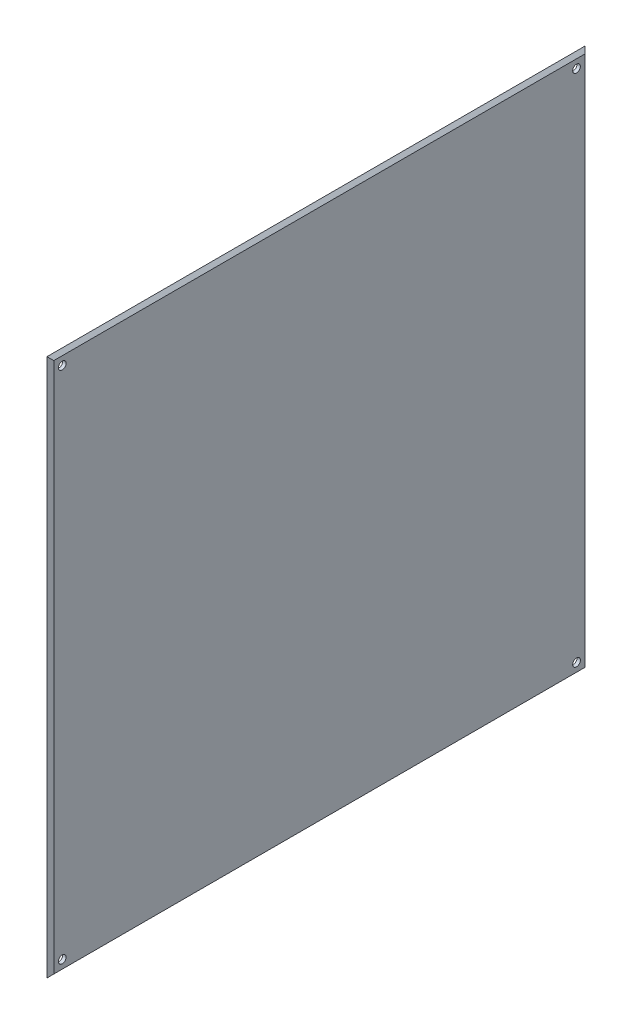
ISO-10303-21;
HEADER;
FILE_DESCRIPTION(('STEP AP214'),'2;1');
FILE_NAME('part.step','',(''),(''),'','','');
FILE_SCHEMA(('AUTOMOTIVE_DESIGN { 1 0 10303 214 1 1 1 1 }'));
ENDSEC;
DATA;
#1=APPLICATION_CONTEXT('core data for automotive mechanical design processes');
#2=APPLICATION_PROTOCOL_DEFINITION('international standard','automotive_design',2000,#1);
#3=PRODUCT_CONTEXT('',#1,'mechanical');
#4=PRODUCT('Part','Part','',(#3));
#5=PRODUCT_RELATED_PRODUCT_CATEGORY('part','',(#4));
#6=PRODUCT_DEFINITION_FORMATION('','',#4);
#7=PRODUCT_DEFINITION_CONTEXT('part definition',#1,'design');
#8=PRODUCT_DEFINITION('design','',#6,#7);
#9=PRODUCT_DEFINITION_SHAPE('','',#8);
#10=(LENGTH_UNIT() NAMED_UNIT(*) SI_UNIT(.MILLI.,.METRE.));
#11=(NAMED_UNIT(*) PLANE_ANGLE_UNIT() SI_UNIT($,.RADIAN.));
#12=(NAMED_UNIT(*) SI_UNIT($,.STERADIAN.) SOLID_ANGLE_UNIT());
#13=UNCERTAINTY_MEASURE_WITH_UNIT(LENGTH_MEASURE(1.E-05),#10,'distance_accuracy_value','');
#14=(GEOMETRIC_REPRESENTATION_CONTEXT(3) GLOBAL_UNCERTAINTY_ASSIGNED_CONTEXT((#13)) GLOBAL_UNIT_ASSIGNED_CONTEXT((#10,
#11,#12)) REPRESENTATION_CONTEXT('',''));
#15=CARTESIAN_POINT('',(0.,0.,0.));
#16=DIRECTION('',(0.,0.,1.));
#17=DIRECTION('',(1.,0.,0.));
#18=AXIS2_PLACEMENT_3D('',#15,#16,#17);
#19=CARTESIAN_POINT('',(2.,0.,0.));
#20=DIRECTION('',(1.,0.,0.));
#21=DIRECTION('',(0.,0.,-1.));
#22=AXIS2_PLACEMENT_3D('',#19,#20,#21);
#23=PLANE('',#22);
#24=CARTESIAN_POINT('',(2.,309.,-309.));
#25=DIRECTION('',(1.,0.,0.));
#26=DIRECTION('',(0.,0.,-1.));
#27=AXIS2_PLACEMENT_3D('',#24,#25,#26);
#28=CIRCLE('',#27,2.24999999999997);
#29=CARTESIAN_POINT('',(2.,309.,-311.25));
#30=VERTEX_POINT('',#29);
#31=EDGE_CURVE('E235',#30,#30,#28,.T.);
#32=ORIENTED_EDGE('',*,*,#31,.F.);
#33=EDGE_LOOP('',(#32));
#34=FACE_BOUND('',#33,.T.);
#35=CARTESIAN_POINT('',(2.,7.00000000000004,-309.));
#36=DIRECTION('',(1.,0.,0.));
#37=DIRECTION('',(0.,0.,-1.));
#38=AXIS2_PLACEMENT_3D('',#35,#36,#37);
#39=CIRCLE('',#38,2.25);
#40=CARTESIAN_POINT('',(2.,7.00000000000004,-311.25));
#41=VERTEX_POINT('',#40);
#42=EDGE_CURVE('E240',#41,#41,#39,.T.);
#43=ORIENTED_EDGE('',*,*,#42,.F.);
#44=EDGE_LOOP('',(#43));
#45=FACE_BOUND('',#44,.T.);
#46=CARTESIAN_POINT('',(2.,7.,-7.));
#47=DIRECTION('',(1.,0.,0.));
#48=DIRECTION('',(0.,0.,-1.));
#49=AXIS2_PLACEMENT_3D('',#46,#47,#48);
#50=CIRCLE('',#49,2.25);
#51=CARTESIAN_POINT('',(2.,7.,-9.25));
#52=VERTEX_POINT('',#51);
#53=EDGE_CURVE('E253',#52,#52,#50,.T.);
#54=ORIENTED_EDGE('',*,*,#53,.F.);
#55=EDGE_LOOP('',(#54));
#56=FACE_BOUND('',#55,.T.);
#57=CARTESIAN_POINT('',(2.,309.,-7.));
#58=DIRECTION('',(1.,0.,0.));
#59=DIRECTION('',(0.,0.,-1.));
#60=AXIS2_PLACEMENT_3D('',#57,#58,#59);
#61=CIRCLE('',#60,2.24999999999997);
#62=CARTESIAN_POINT('',(2.,309.,-9.24999999999998));
#63=VERTEX_POINT('',#62);
#64=EDGE_CURVE('E256',#63,#63,#61,.T.);
#65=ORIENTED_EDGE('',*,*,#64,.F.);
#66=EDGE_LOOP('',(#65));
#67=FACE_BOUND('',#66,.T.);
#68=DIRECTION('',(0.,0.,1.));
#69=VECTOR('',#68,1.);
#70=CARTESIAN_POINT('',(2.,314.,0.));
#71=LINE('',#70,#69);
#72=CARTESIAN_POINT('',(2.,314.,-314.));
#73=VERTEX_POINT('',#72);
#74=CARTESIAN_POINT('',(2.,314.,-2.));
#75=VERTEX_POINT('',#74);
#76=EDGE_CURVE('E56',#73,#75,#71,.T.);
#77=ORIENTED_EDGE('',*,*,#76,.T.);
#78=DIRECTION('',(0.,-1.,0.));
#79=VECTOR('',#78,1.);
#80=CARTESIAN_POINT('',(2.,0.,-2.));
#81=LINE('',#80,#79);
#82=CARTESIAN_POINT('',(2.,2.,-2.));
#83=VERTEX_POINT('',#82);
#84=EDGE_CURVE('E11',#75,#83,#81,.T.);
#85=ORIENTED_EDGE('',*,*,#84,.T.);
#86=DIRECTION('',(0.,0.,-1.));
#87=VECTOR('',#86,1.);
#88=CARTESIAN_POINT('',(2.,2.,-316.));
#89=LINE('',#88,#87);
#90=CARTESIAN_POINT('',(2.,2.,-314.));
#91=VERTEX_POINT('',#90);
#92=EDGE_CURVE('E121',#83,#91,#89,.T.);
#93=ORIENTED_EDGE('',*,*,#92,.T.);
#94=DIRECTION('',(0.,1.,0.));
#95=VECTOR('',#94,1.);
#96=CARTESIAN_POINT('',(2.,316.,-314.));
#97=LINE('',#96,#95);
#98=EDGE_CURVE('E67',#91,#73,#97,.T.);
#99=ORIENTED_EDGE('',*,*,#98,.T.);
#100=EDGE_LOOP('',(#77,#85,#93,#99));
#101=FACE_BOUND('',#100,.T.);
#102=ADVANCED_FACE('F45',(#34,#45,#56,#67,#101),#23,.T.);
#103=CARTESIAN_POINT('',(0.,0.,0.));
#104=DIRECTION('',(1.,0.,0.));
#105=DIRECTION('',(0.,0.,-1.));
#106=AXIS2_PLACEMENT_3D('',#103,#104,#105);
#107=PLANE('',#106);
#108=CARTESIAN_POINT('',(0.,309.,-309.));
#109=DIRECTION('',(1.,0.,0.));
#110=DIRECTION('',(0.,0.,-1.));
#111=AXIS2_PLACEMENT_3D('',#108,#109,#110);
#112=CIRCLE('',#111,2.24999999999997);
#113=CARTESIAN_POINT('',(0.,309.,-311.25));
#114=VERTEX_POINT('',#113);
#115=EDGE_CURVE('E238',#114,#114,#112,.T.);
#116=ORIENTED_EDGE('',*,*,#115,.T.);
#117=EDGE_LOOP('',(#116));
#118=FACE_BOUND('',#117,.T.);
#119=CARTESIAN_POINT('',(0.,7.00000000000004,-309.));
#120=DIRECTION('',(1.,0.,0.));
#121=DIRECTION('',(0.,0.,-1.));
#122=AXIS2_PLACEMENT_3D('',#119,#120,#121);
#123=CIRCLE('',#122,2.25);
#124=CARTESIAN_POINT('',(0.,7.00000000000004,-311.25));
#125=VERTEX_POINT('',#124);
#126=EDGE_CURVE('E246',#125,#125,#123,.T.);
#127=ORIENTED_EDGE('',*,*,#126,.T.);
#128=EDGE_LOOP('',(#127));
#129=FACE_BOUND('',#128,.T.);
#130=CARTESIAN_POINT('',(0.,7.,-7.));
#131=DIRECTION('',(1.,0.,0.));
#132=DIRECTION('',(0.,0.,-1.));
#133=AXIS2_PLACEMENT_3D('',#130,#131,#132);
#134=CIRCLE('',#133,2.25);
#135=CARTESIAN_POINT('',(0.,7.,-9.25));
#136=VERTEX_POINT('',#135);
#137=EDGE_CURVE('E50',#136,#136,#134,.T.);
#138=ORIENTED_EDGE('',*,*,#137,.T.);
#139=EDGE_LOOP('',(#138));
#140=FACE_BOUND('',#139,.T.);
#141=CARTESIAN_POINT('',(0.,309.,-7.));
#142=DIRECTION('',(1.,0.,0.));
#143=DIRECTION('',(0.,0.,-1.));
#144=AXIS2_PLACEMENT_3D('',#141,#142,#143);
#145=CIRCLE('',#144,2.24999999999997);
#146=CARTESIAN_POINT('',(0.,309.,-9.24999999999998));
#147=VERTEX_POINT('',#146);
#148=EDGE_CURVE('E113',#147,#147,#145,.T.);
#149=ORIENTED_EDGE('',*,*,#148,.T.);
#150=EDGE_LOOP('',(#149));
#151=FACE_BOUND('',#150,.T.);
#152=DIRECTION('',(0.,0.,-1.));
#153=VECTOR('',#152,1.);
#154=CARTESIAN_POINT('',(0.,0.,0.));
#155=LINE('',#154,#153);
#156=CARTESIAN_POINT('',(0.,0.,0.));
#157=VERTEX_POINT('',#156);
#158=CARTESIAN_POINT('',(0.,0.,-316.));
#159=VERTEX_POINT('',#158);
#160=EDGE_CURVE('E92',#157,#159,#155,.T.);
#161=ORIENTED_EDGE('',*,*,#160,.F.);
#162=DIRECTION('',(0.,1.,0.));
#163=VECTOR('',#162,1.);
#164=CARTESIAN_POINT('',(0.,0.,0.));
#165=LINE('',#164,#163);
#166=CARTESIAN_POINT('',(0.,316.,0.));
#167=VERTEX_POINT('',#166);
#168=EDGE_CURVE('E118',#157,#167,#165,.T.);
#169=ORIENTED_EDGE('',*,*,#168,.T.);
#170=DIRECTION('',(0.,0.,-1.));
#171=VECTOR('',#170,1.);
#172=CARTESIAN_POINT('',(0.,316.,0.));
#173=LINE('',#172,#171);
#174=CARTESIAN_POINT('',(0.,316.,-316.));
#175=VERTEX_POINT('',#174);
#176=EDGE_CURVE('E95',#167,#175,#173,.T.);
#177=ORIENTED_EDGE('',*,*,#176,.T.);
#178=DIRECTION('',(0.,1.,0.));
#179=VECTOR('',#178,1.);
#180=CARTESIAN_POINT('',(0.,0.,-316.));
#181=LINE('',#180,#179);
#182=EDGE_CURVE('E87',#159,#175,#181,.T.);
#183=ORIENTED_EDGE('',*,*,#182,.F.);
#184=EDGE_LOOP('',(#161,#169,#177,#183));
#185=FACE_BOUND('',#184,.T.);
#186=ADVANCED_FACE('F89',(#118,#129,#140,#151,#185),#107,.F.);
#187=CARTESIAN_POINT('',(2.,0.,-314.));
#188=DIRECTION('',(0.707106781186547,0.,-0.707106781186547));
#189=DIRECTION('',(0.,-1.,0.));
#190=AXIS2_PLACEMENT_3D('',#187,#188,#189);
#191=PLANE('',#190);
#192=DIRECTION('',(-0.577350269189626,0.577350269189626,-0.577350269189626));
#193=VECTOR('',#192,1.);
#194=CARTESIAN_POINT('',(106.666666666667,209.333333333333,-209.333333333333));
#195=LINE('',#194,#193);
#196=EDGE_CURVE('E105',#73,#175,#195,.T.);
#197=ORIENTED_EDGE('',*,*,#196,.F.);
#198=ORIENTED_EDGE('',*,*,#98,.F.);
#199=DIRECTION('',(0.577350269189626,0.577350269189626,0.577350269189626));
#200=VECTOR('',#199,1.);
#201=CARTESIAN_POINT('',(106.666666666667,106.666666666667,-209.333333333333));
#202=LINE('',#201,#200);
#203=EDGE_CURVE('E101',#159,#91,#202,.T.);
#204=ORIENTED_EDGE('',*,*,#203,.F.);
#205=ORIENTED_EDGE('',*,*,#182,.T.);
#206=EDGE_LOOP('',(#197,#198,#204,#205));
#207=FACE_BOUND('',#206,.T.);
#208=ADVANCED_FACE('F48',(#207),#191,.T.);
#209=CARTESIAN_POINT('',(2.,2.,0.));
#210=DIRECTION('',(0.707106781186547,-0.707106781186547,0.));
#211=DIRECTION('',(0.,0.,1.));
#212=AXIS2_PLACEMENT_3D('',#209,#210,#211);
#213=PLANE('',#212);
#214=ORIENTED_EDGE('',*,*,#203,.T.);
#215=ORIENTED_EDGE('',*,*,#92,.F.);
#216=DIRECTION('',(0.577350269189626,0.577350269189626,-0.577350269189626));
#217=VECTOR('',#216,1.);
#218=CARTESIAN_POINT('',(1.33333333333333,1.33333333333333,-1.33333333333333));
#219=LINE('',#218,#217);
#220=EDGE_CURVE('E107',#157,#83,#219,.T.);
#221=ORIENTED_EDGE('',*,*,#220,.F.);
#222=ORIENTED_EDGE('',*,*,#160,.T.);
#223=EDGE_LOOP('',(#214,#215,#221,#222));
#224=FACE_BOUND('',#223,.T.);
#225=ADVANCED_FACE('F106',(#224),#213,.T.);
#226=CARTESIAN_POINT('',(0.,316.,0.));
#227=DIRECTION('',(-0.707106781186547,-0.707106781186547,0.));
#228=DIRECTION('',(0.,0.,-1.));
#229=AXIS2_PLACEMENT_3D('',#226,#227,#228);
#230=PLANE('',#229);
#231=ORIENTED_EDGE('',*,*,#196,.T.);
#232=ORIENTED_EDGE('',*,*,#176,.F.);
#233=DIRECTION('',(0.577350269189626,-0.577350269189626,-0.577350269189626));
#234=VECTOR('',#233,1.);
#235=CARTESIAN_POINT('',(0.,316.,0.));
#236=LINE('',#235,#234);
#237=EDGE_CURVE('E128',#75,#167,#236,.F.);
#238=ORIENTED_EDGE('',*,*,#237,.F.);
#239=ORIENTED_EDGE('',*,*,#76,.F.);
#240=EDGE_LOOP('',(#231,#232,#238,#239));
#241=FACE_BOUND('',#240,.T.);
#242=ADVANCED_FACE('F136',(#241),#230,.F.);
#243=CARTESIAN_POINT('',(0.,0.,0.));
#244=DIRECTION('',(-0.707106781186547,0.,-0.707106781186547));
#245=DIRECTION('',(0.,1.,0.));
#246=AXIS2_PLACEMENT_3D('',#243,#244,#245);
#247=PLANE('',#246);
#248=ORIENTED_EDGE('',*,*,#220,.T.);
#249=ORIENTED_EDGE('',*,*,#84,.F.);
#250=ORIENTED_EDGE('',*,*,#237,.T.);
#251=ORIENTED_EDGE('',*,*,#168,.F.);
#252=EDGE_LOOP('',(#248,#249,#250,#251));
#253=FACE_BOUND('',#252,.T.);
#254=ADVANCED_FACE('F139',(#253),#247,.F.);
#255=CARTESIAN_POINT('',(2.,309.,-7.));
#256=DIRECTION('',(1.,0.,0.));
#257=DIRECTION('',(0.,0.,-1.));
#258=AXIS2_PLACEMENT_3D('',#255,#256,#257);
#259=CYLINDRICAL_SURFACE('',#258,2.24999999999997);
#260=ORIENTED_EDGE('',*,*,#64,.T.);
#261=EDGE_LOOP('',(#260));
#262=FACE_BOUND('',#261,.T.);
#263=ORIENTED_EDGE('',*,*,#148,.F.);
#264=EDGE_LOOP('',(#263));
#265=FACE_BOUND('',#264,.T.);
#266=ADVANCED_FACE('F152',(#262,#265),#259,.F.);
#267=CARTESIAN_POINT('',(2.,7.,-7.));
#268=DIRECTION('',(1.,0.,0.));
#269=DIRECTION('',(0.,0.,-1.));
#270=AXIS2_PLACEMENT_3D('',#267,#268,#269);
#271=CYLINDRICAL_SURFACE('',#270,2.25);
#272=ORIENTED_EDGE('',*,*,#53,.T.);
#273=EDGE_LOOP('',(#272));
#274=FACE_BOUND('',#273,.T.);
#275=ORIENTED_EDGE('',*,*,#137,.F.);
#276=EDGE_LOOP('',(#275));
#277=FACE_BOUND('',#276,.T.);
#278=ADVANCED_FACE('F202',(#274,#277),#271,.F.);
#279=CARTESIAN_POINT('',(2.,7.00000000000004,-309.));
#280=DIRECTION('',(1.,0.,0.));
#281=DIRECTION('',(0.,0.,-1.));
#282=AXIS2_PLACEMENT_3D('',#279,#280,#281);
#283=CYLINDRICAL_SURFACE('',#282,2.25);
#284=ORIENTED_EDGE('',*,*,#42,.T.);
#285=EDGE_LOOP('',(#284));
#286=FACE_BOUND('',#285,.T.);
#287=ORIENTED_EDGE('',*,*,#126,.F.);
#288=EDGE_LOOP('',(#287));
#289=FACE_BOUND('',#288,.T.);
#290=ADVANCED_FACE('F211',(#286,#289),#283,.F.);
#291=CARTESIAN_POINT('',(2.,309.,-309.));
#292=DIRECTION('',(1.,0.,0.));
#293=DIRECTION('',(0.,0.,-1.));
#294=AXIS2_PLACEMENT_3D('',#291,#292,#293);
#295=CYLINDRICAL_SURFACE('',#294,2.24999999999997);
#296=ORIENTED_EDGE('',*,*,#31,.T.);
#297=EDGE_LOOP('',(#296));
#298=FACE_BOUND('',#297,.T.);
#299=ORIENTED_EDGE('',*,*,#115,.F.);
#300=EDGE_LOOP('',(#299));
#301=FACE_BOUND('',#300,.T.);
#302=ADVANCED_FACE('F220',(#298,#301),#295,.F.);
#303=CLOSED_SHELL('',(#102,#186,#208,#225,#242,#254,#266,#278,#290,#302));
#304=MANIFOLD_SOLID_BREP('B2',#303);
#305=ADVANCED_BREP_SHAPE_REPRESENTATION('',(#18,#304),#14);
#306=SHAPE_DEFINITION_REPRESENTATION(#9,#305);
ENDSEC;
END-ISO-10303-21;
